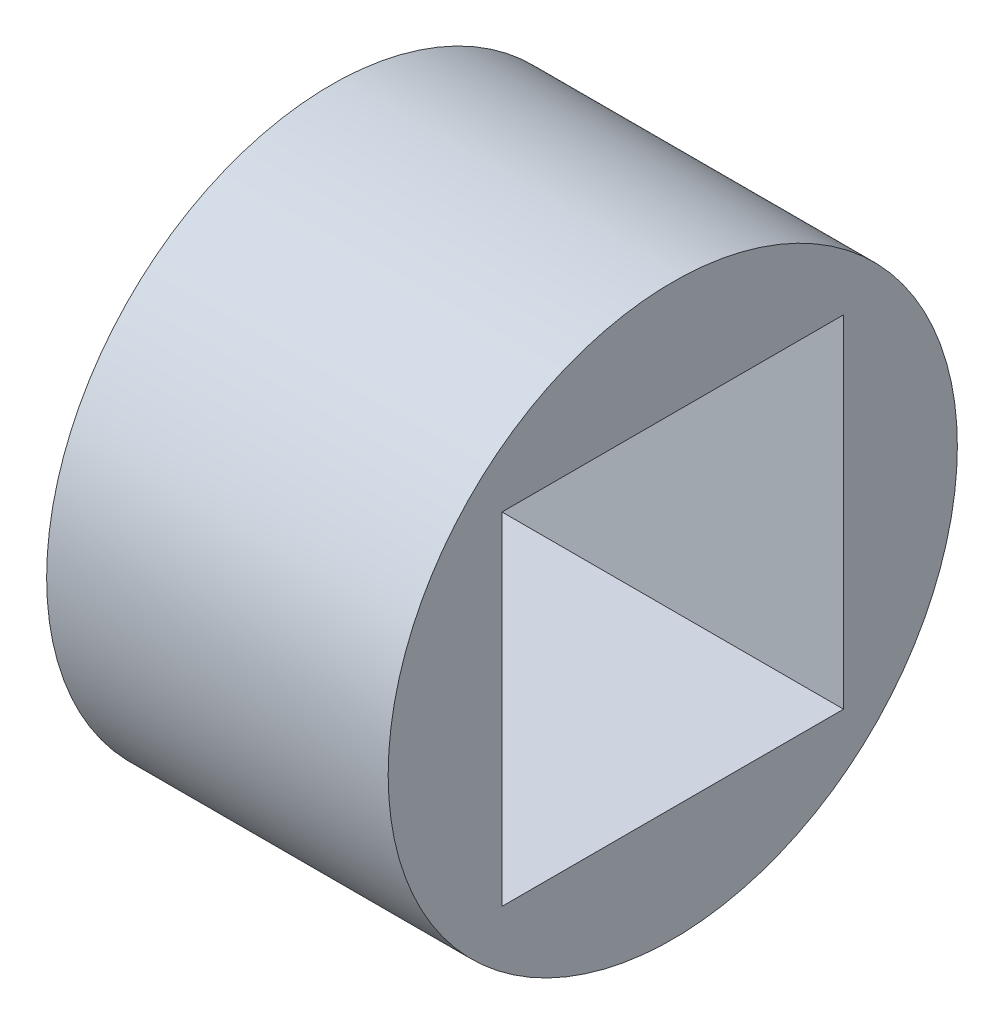
ISO-10303-21;
HEADER;
FILE_DESCRIPTION(('STEP AP214'),'2;1');
FILE_NAME('part.step','',(''),(''),'','','');
FILE_SCHEMA(('AUTOMOTIVE_DESIGN { 1 0 10303 214 1 1 1 1 }'));
ENDSEC;
DATA;
#1=APPLICATION_CONTEXT('core data for automotive mechanical design processes');
#2=APPLICATION_PROTOCOL_DEFINITION('international standard','automotive_design',2000,#1);
#3=PRODUCT_CONTEXT('',#1,'mechanical');
#4=PRODUCT('Part','Part','',(#3));
#5=PRODUCT_RELATED_PRODUCT_CATEGORY('part','',(#4));
#6=PRODUCT_DEFINITION_FORMATION('','',#4);
#7=PRODUCT_DEFINITION_CONTEXT('part definition',#1,'design');
#8=PRODUCT_DEFINITION('design','',#6,#7);
#9=PRODUCT_DEFINITION_SHAPE('','',#8);
#10=(LENGTH_UNIT() NAMED_UNIT(*) SI_UNIT(.MILLI.,.METRE.));
#11=(NAMED_UNIT(*) PLANE_ANGLE_UNIT() SI_UNIT($,.RADIAN.));
#12=(NAMED_UNIT(*) SI_UNIT($,.STERADIAN.) SOLID_ANGLE_UNIT());
#13=UNCERTAINTY_MEASURE_WITH_UNIT(LENGTH_MEASURE(1.E-05),#10,'distance_accuracy_value','');
#14=(GEOMETRIC_REPRESENTATION_CONTEXT(3) GLOBAL_UNCERTAINTY_ASSIGNED_CONTEXT((#13)) GLOBAL_UNIT_ASSIGNED_CONTEXT((#10,
#11,#12)) REPRESENTATION_CONTEXT('',''));
#15=CARTESIAN_POINT('',(0.,0.,0.));
#16=DIRECTION('',(0.,0.,1.));
#17=DIRECTION('',(1.,0.,0.));
#18=AXIS2_PLACEMENT_3D('',#15,#16,#17);
#19=CARTESIAN_POINT('',(3.,0.,0.));
#20=DIRECTION('',(1.,0.,0.));
#21=DIRECTION('',(0.,0.,-1.));
#22=AXIS2_PLACEMENT_3D('',#19,#20,#21);
#23=PLANE('',#22);
#24=CARTESIAN_POINT('',(3.,0.,0.));
#25=DIRECTION('',(1.,0.,0.));
#26=DIRECTION('',(0.,0.,-1.));
#27=AXIS2_PLACEMENT_3D('',#24,#25,#26);
#28=CIRCLE('',#27,2.5);
#29=CARTESIAN_POINT('',(3.,0.,-2.5));
#30=VERTEX_POINT('',#29);
#31=EDGE_CURVE('E11',#30,#30,#28,.T.);
#32=ORIENTED_EDGE('',*,*,#31,.T.);
#33=EDGE_LOOP('',(#32));
#34=FACE_BOUND('',#33,.T.);
#35=DIRECTION('',(0.,0.,1.));
#36=VECTOR('',#35,1.);
#37=CARTESIAN_POINT('',(3.,1.5,1.5));
#38=LINE('',#37,#36);
#39=CARTESIAN_POINT('',(3.,1.5,-1.5));
#40=VERTEX_POINT('',#39);
#41=CARTESIAN_POINT('',(3.,1.5,1.5));
#42=VERTEX_POINT('',#41);
#43=EDGE_CURVE('E82',#40,#42,#38,.T.);
#44=ORIENTED_EDGE('',*,*,#43,.F.);
#45=DIRECTION('',(0.,1.,0.));
#46=VECTOR('',#45,1.);
#47=CARTESIAN_POINT('',(3.,-1.5,-1.5));
#48=LINE('',#47,#46);
#49=CARTESIAN_POINT('',(3.,-1.5,-1.5));
#50=VERTEX_POINT('',#49);
#51=EDGE_CURVE('E74',#50,#40,#48,.T.);
#52=ORIENTED_EDGE('',*,*,#51,.F.);
#53=DIRECTION('',(0.,0.,-1.));
#54=VECTOR('',#53,1.);
#55=CARTESIAN_POINT('',(3.,-1.5,1.5));
#56=LINE('',#55,#54);
#57=CARTESIAN_POINT('',(3.,-1.5,1.5));
#58=VERTEX_POINT('',#57);
#59=EDGE_CURVE('E95',#58,#50,#56,.T.);
#60=ORIENTED_EDGE('',*,*,#59,.F.);
#61=DIRECTION('',(0.,-1.,0.));
#62=VECTOR('',#61,1.);
#63=CARTESIAN_POINT('',(3.,-1.5,1.5));
#64=LINE('',#63,#62);
#65=EDGE_CURVE('E93',#42,#58,#64,.T.);
#66=ORIENTED_EDGE('',*,*,#65,.F.);
#67=EDGE_LOOP('',(#44,#52,#60,#66));
#68=FACE_BOUND('',#67,.T.);
#69=ADVANCED_FACE('F33',(#34,#68),#23,.T.);
#70=CARTESIAN_POINT('',(0.,0.,0.));
#71=DIRECTION('',(1.,0.,0.));
#72=DIRECTION('',(0.,0.,-1.));
#73=AXIS2_PLACEMENT_3D('',#70,#71,#72);
#74=PLANE('',#73);
#75=CARTESIAN_POINT('',(0.,0.,0.));
#76=DIRECTION('',(1.,0.,0.));
#77=DIRECTION('',(0.,0.,-1.));
#78=AXIS2_PLACEMENT_3D('',#75,#76,#77);
#79=CIRCLE('',#78,2.5);
#80=CARTESIAN_POINT('',(0.,0.,-2.5));
#81=VERTEX_POINT('',#80);
#82=EDGE_CURVE('E37',#81,#81,#79,.T.);
#83=ORIENTED_EDGE('',*,*,#82,.F.);
#84=EDGE_LOOP('',(#83));
#85=FACE_BOUND('',#84,.T.);
#86=DIRECTION('',(0.,1.,0.));
#87=VECTOR('',#86,1.);
#88=CARTESIAN_POINT('',(0.,-1.5,-1.5));
#89=LINE('',#88,#87);
#90=CARTESIAN_POINT('',(0.,-1.5,-1.5));
#91=VERTEX_POINT('',#90);
#92=CARTESIAN_POINT('',(0.,1.5,-1.5));
#93=VERTEX_POINT('',#92);
#94=EDGE_CURVE('E56',#91,#93,#89,.T.);
#95=ORIENTED_EDGE('',*,*,#94,.T.);
#96=DIRECTION('',(0.,0.,1.));
#97=VECTOR('',#96,1.);
#98=CARTESIAN_POINT('',(0.,1.5,1.5));
#99=LINE('',#98,#97);
#100=CARTESIAN_POINT('',(0.,1.5,1.5));
#101=VERTEX_POINT('',#100);
#102=EDGE_CURVE('E89',#93,#101,#99,.T.);
#103=ORIENTED_EDGE('',*,*,#102,.T.);
#104=DIRECTION('',(0.,-1.,0.));
#105=VECTOR('',#104,1.);
#106=CARTESIAN_POINT('',(0.,-1.5,1.5));
#107=LINE('',#106,#105);
#108=CARTESIAN_POINT('',(0.,-1.5,1.5));
#109=VERTEX_POINT('',#108);
#110=EDGE_CURVE('E101',#101,#109,#107,.T.);
#111=ORIENTED_EDGE('',*,*,#110,.T.);
#112=DIRECTION('',(0.,0.,-1.));
#113=VECTOR('',#112,1.);
#114=CARTESIAN_POINT('',(0.,-1.5,1.5));
#115=LINE('',#114,#113);
#116=EDGE_CURVE('E83',#109,#91,#115,.T.);
#117=ORIENTED_EDGE('',*,*,#116,.T.);
#118=EDGE_LOOP('',(#95,#103,#111,#117));
#119=FACE_BOUND('',#118,.T.);
#120=ADVANCED_FACE('F112',(#85,#119),#74,.F.);
#121=CARTESIAN_POINT('',(3.,0.,0.));
#122=DIRECTION('',(-1.,0.,0.));
#123=DIRECTION('',(0.,0.,1.));
#124=AXIS2_PLACEMENT_3D('',#121,#122,#123);
#125=CYLINDRICAL_SURFACE('',#124,2.5);
#126=ORIENTED_EDGE('',*,*,#31,.F.);
#127=EDGE_LOOP('',(#126));
#128=FACE_BOUND('',#127,.T.);
#129=ORIENTED_EDGE('',*,*,#82,.T.);
#130=EDGE_LOOP('',(#129));
#131=FACE_BOUND('',#130,.T.);
#132=ADVANCED_FACE('F35',(#128,#131),#125,.T.);
#133=CARTESIAN_POINT('',(3.,-1.5,-1.5));
#134=DIRECTION('',(0.,0.,1.));
#135=DIRECTION('',(1.,0.,0.));
#136=AXIS2_PLACEMENT_3D('',#133,#134,#135);
#137=PLANE('',#136);
#138=ORIENTED_EDGE('',*,*,#94,.F.);
#139=DIRECTION('',(-1.,0.,0.));
#140=VECTOR('',#139,1.);
#141=CARTESIAN_POINT('',(3.,-1.5,-1.5));
#142=LINE('',#141,#140);
#143=EDGE_CURVE('E78',#50,#91,#142,.T.);
#144=ORIENTED_EDGE('',*,*,#143,.F.);
#145=ORIENTED_EDGE('',*,*,#51,.T.);
#146=DIRECTION('',(-1.,0.,0.));
#147=VECTOR('',#146,1.);
#148=CARTESIAN_POINT('',(3.,1.5,-1.5));
#149=LINE('',#148,#147);
#150=EDGE_CURVE('E77',#40,#93,#149,.T.);
#151=ORIENTED_EDGE('',*,*,#150,.T.);
#152=EDGE_LOOP('',(#138,#144,#145,#151));
#153=FACE_BOUND('',#152,.T.);
#154=ADVANCED_FACE('F76',(#153),#137,.T.);
#155=CARTESIAN_POINT('',(3.,1.5,1.5));
#156=DIRECTION('',(0.,-1.,0.));
#157=DIRECTION('',(0.,0.,-1.));
#158=AXIS2_PLACEMENT_3D('',#155,#156,#157);
#159=PLANE('',#158);
#160=ORIENTED_EDGE('',*,*,#102,.F.);
#161=ORIENTED_EDGE('',*,*,#150,.F.);
#162=ORIENTED_EDGE('',*,*,#43,.T.);
#163=DIRECTION('',(-1.,0.,0.));
#164=VECTOR('',#163,1.);
#165=CARTESIAN_POINT('',(3.,1.5,1.5));
#166=LINE('',#165,#164);
#167=EDGE_CURVE('E90',#42,#101,#166,.T.);
#168=ORIENTED_EDGE('',*,*,#167,.T.);
#169=EDGE_LOOP('',(#160,#161,#162,#168));
#170=FACE_BOUND('',#169,.T.);
#171=ADVANCED_FACE('F86',(#170),#159,.T.);
#172=CARTESIAN_POINT('',(3.,-1.5,1.5));
#173=DIRECTION('',(0.,0.,-1.));
#174=DIRECTION('',(-1.,0.,0.));
#175=AXIS2_PLACEMENT_3D('',#172,#173,#174);
#176=PLANE('',#175);
#177=ORIENTED_EDGE('',*,*,#110,.F.);
#178=ORIENTED_EDGE('',*,*,#167,.F.);
#179=ORIENTED_EDGE('',*,*,#65,.T.);
#180=DIRECTION('',(-1.,0.,0.));
#181=VECTOR('',#180,1.);
#182=CARTESIAN_POINT('',(3.,-1.5,1.5));
#183=LINE('',#182,#181);
#184=EDGE_CURVE('E48',#58,#109,#183,.T.);
#185=ORIENTED_EDGE('',*,*,#184,.T.);
#186=EDGE_LOOP('',(#177,#178,#179,#185));
#187=FACE_BOUND('',#186,.T.);
#188=ADVANCED_FACE('F110',(#187),#176,.T.);
#189=CARTESIAN_POINT('',(3.,-1.5,1.5));
#190=DIRECTION('',(0.,1.,0.));
#191=DIRECTION('',(0.,0.,1.));
#192=AXIS2_PLACEMENT_3D('',#189,#190,#191);
#193=PLANE('',#192);
#194=ORIENTED_EDGE('',*,*,#116,.F.);
#195=ORIENTED_EDGE('',*,*,#184,.F.);
#196=ORIENTED_EDGE('',*,*,#59,.T.);
#197=ORIENTED_EDGE('',*,*,#143,.T.);
#198=EDGE_LOOP('',(#194,#195,#196,#197));
#199=FACE_BOUND('',#198,.T.);
#200=ADVANCED_FACE('F113',(#199),#193,.T.);
#201=CLOSED_SHELL('',(#69,#120,#132,#154,#171,#188,#200));
#202=MANIFOLD_SOLID_BREP('B2',#201);
#203=ADVANCED_BREP_SHAPE_REPRESENTATION('',(#18,#202),#14);
#204=SHAPE_DEFINITION_REPRESENTATION(#9,#203);
ENDSEC;
END-ISO-10303-21;
